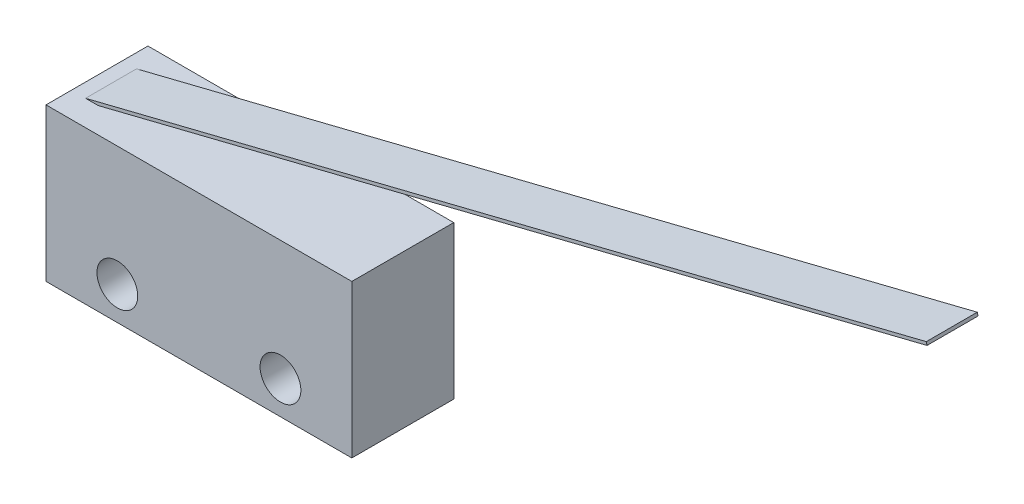
ISO-10303-21;
HEADER;
FILE_DESCRIPTION(('STEP AP214'),'2;1');
FILE_NAME('part.step','',(''),(''),'','','');
FILE_SCHEMA(('AUTOMOTIVE_DESIGN { 1 0 10303 214 1 1 1 1 }'));
ENDSEC;
DATA;
#1=APPLICATION_CONTEXT('core data for automotive mechanical design processes');
#2=APPLICATION_PROTOCOL_DEFINITION('international standard','automotive_design',2000,#1);
#3=PRODUCT_CONTEXT('',#1,'mechanical');
#4=PRODUCT('Part','Part','',(#3));
#5=PRODUCT_RELATED_PRODUCT_CATEGORY('part','',(#4));
#6=PRODUCT_DEFINITION_FORMATION('','',#4);
#7=PRODUCT_DEFINITION_CONTEXT('part definition',#1,'design');
#8=PRODUCT_DEFINITION('design','',#6,#7);
#9=PRODUCT_DEFINITION_SHAPE('','',#8);
#10=(LENGTH_UNIT() NAMED_UNIT(*) SI_UNIT(.MILLI.,.METRE.));
#11=(NAMED_UNIT(*) PLANE_ANGLE_UNIT() SI_UNIT($,.RADIAN.));
#12=(NAMED_UNIT(*) SI_UNIT($,.STERADIAN.) SOLID_ANGLE_UNIT());
#13=UNCERTAINTY_MEASURE_WITH_UNIT(LENGTH_MEASURE(1.E-05),#10,'distance_accuracy_value','');
#14=(GEOMETRIC_REPRESENTATION_CONTEXT(3) GLOBAL_UNCERTAINTY_ASSIGNED_CONTEXT((#13)) GLOBAL_UNIT_ASSIGNED_CONTEXT((#10,
#11,#12)) REPRESENTATION_CONTEXT('',''));
#15=CARTESIAN_POINT('',(0.,0.,0.));
#16=DIRECTION('',(0.,0.,1.));
#17=DIRECTION('',(1.,0.,0.));
#18=AXIS2_PLACEMENT_3D('',#15,#16,#17);
#19=CARTESIAN_POINT('',(0.,0.,6.35));
#20=DIRECTION('',(0.,0.,-1.));
#21=DIRECTION('',(-1.,0.,0.));
#22=AXIS2_PLACEMENT_3D('',#19,#20,#21);
#23=PLANE('',#22);
#24=CARTESIAN_POINT('',(4.445,2.06375,6.35));
#25=DIRECTION('',(0.,0.,1.));
#26=DIRECTION('',(1.,0.,0.));
#27=AXIS2_PLACEMENT_3D('',#24,#25,#26);
#28=CIRCLE('',#27,1.27);
#29=CARTESIAN_POINT('',(5.715,2.06375,6.35));
#30=VERTEX_POINT('',#29);
#31=EDGE_CURVE('E239',#30,#30,#28,.T.);
#32=ORIENTED_EDGE('',*,*,#31,.F.);
#33=EDGE_LOOP('',(#32));
#34=FACE_BOUND('',#33,.T.);
#35=DIRECTION('',(0.,-1.,0.));
#36=VECTOR('',#35,1.);
#37=CARTESIAN_POINT('',(0.,0.,6.35));
#38=LINE('',#37,#36);
#39=CARTESIAN_POINT('',(0.,9.525,6.35));
#40=VERTEX_POINT('',#39);
#41=CARTESIAN_POINT('',(0.,0.,6.35));
#42=VERTEX_POINT('',#41);
#43=EDGE_CURVE('E153',#40,#42,#38,.T.);
#44=ORIENTED_EDGE('',*,*,#43,.T.);
#45=DIRECTION('',(1.,0.,0.));
#46=VECTOR('',#45,1.);
#47=CARTESIAN_POINT('',(0.,0.,6.35));
#48=LINE('',#47,#46);
#49=CARTESIAN_POINT('',(19.05,0.,6.35));
#50=VERTEX_POINT('',#49);
#51=EDGE_CURVE('E96',#42,#50,#48,.T.);
#52=ORIENTED_EDGE('',*,*,#51,.T.);
#53=DIRECTION('',(0.,1.,0.));
#54=VECTOR('',#53,1.);
#55=CARTESIAN_POINT('',(19.05,0.,6.35));
#56=LINE('',#55,#54);
#57=CARTESIAN_POINT('',(19.05,9.525,6.35));
#58=VERTEX_POINT('',#57);
#59=EDGE_CURVE('E158',#50,#58,#56,.T.);
#60=ORIENTED_EDGE('',*,*,#59,.T.);
#61=DIRECTION('',(-1.,0.,0.));
#62=VECTOR('',#61,1.);
#63=CARTESIAN_POINT('',(0.,9.525,6.35));
#64=LINE('',#63,#62);
#65=EDGE_CURVE('E68',#58,#40,#64,.T.);
#66=ORIENTED_EDGE('',*,*,#65,.T.);
#67=EDGE_LOOP('',(#44,#52,#60,#66));
#68=FACE_BOUND('',#67,.T.);
#69=CARTESIAN_POINT('',(14.605,2.06375,6.35));
#70=DIRECTION('',(0.,0.,-1.));
#71=DIRECTION('',(-1.,0.,0.));
#72=AXIS2_PLACEMENT_3D('',#69,#70,#71);
#73=CIRCLE('',#72,1.27);
#74=CARTESIAN_POINT('',(13.335,2.06375,6.35));
#75=VERTEX_POINT('',#74);
#76=EDGE_CURVE('E236',#75,#75,#73,.T.);
#77=ORIENTED_EDGE('',*,*,#76,.T.);
#78=EDGE_LOOP('',(#77));
#79=FACE_BOUND('',#78,.T.);
#80=ADVANCED_FACE('F43',(#34,#68,#79),#23,.F.);
#81=CARTESIAN_POINT('',(0.,0.,0.));
#82=DIRECTION('',(0.,0.,-1.));
#83=DIRECTION('',(-1.,0.,0.));
#84=AXIS2_PLACEMENT_3D('',#81,#82,#83);
#85=PLANE('',#84);
#86=DIRECTION('',(0.,-1.,0.));
#87=VECTOR('',#86,1.);
#88=CARTESIAN_POINT('',(0.,0.,0.));
#89=LINE('',#88,#87);
#90=CARTESIAN_POINT('',(0.,9.525,0.));
#91=VERTEX_POINT('',#90);
#92=CARTESIAN_POINT('',(0.,0.,0.));
#93=VERTEX_POINT('',#92);
#94=EDGE_CURVE('E142',#91,#93,#89,.T.);
#95=ORIENTED_EDGE('',*,*,#94,.F.);
#96=DIRECTION('',(-1.,0.,0.));
#97=VECTOR('',#96,1.);
#98=CARTESIAN_POINT('',(0.,9.525,0.));
#99=LINE('',#98,#97);
#100=CARTESIAN_POINT('',(19.05,9.525,0.));
#101=VERTEX_POINT('',#100);
#102=EDGE_CURVE('E89',#101,#91,#99,.T.);
#103=ORIENTED_EDGE('',*,*,#102,.F.);
#104=DIRECTION('',(0.,1.,0.));
#105=VECTOR('',#104,1.);
#106=CARTESIAN_POINT('',(19.05,0.,0.));
#107=LINE('',#106,#105);
#108=CARTESIAN_POINT('',(19.05,0.,0.));
#109=VERTEX_POINT('',#108);
#110=EDGE_CURVE('E166',#109,#101,#107,.T.);
#111=ORIENTED_EDGE('',*,*,#110,.F.);
#112=DIRECTION('',(1.,0.,0.));
#113=VECTOR('',#112,1.);
#114=CARTESIAN_POINT('',(0.,0.,0.));
#115=LINE('',#114,#113);
#116=EDGE_CURVE('E147',#93,#109,#115,.T.);
#117=ORIENTED_EDGE('',*,*,#116,.F.);
#118=EDGE_LOOP('',(#95,#103,#111,#117));
#119=FACE_BOUND('',#118,.T.);
#120=CARTESIAN_POINT('',(4.445,2.06375,0.));
#121=DIRECTION('',(0.,0.,1.));
#122=DIRECTION('',(1.,0.,0.));
#123=AXIS2_PLACEMENT_3D('',#120,#121,#122);
#124=CIRCLE('',#123,1.27);
#125=CARTESIAN_POINT('',(5.715,2.06375,0.));
#126=VERTEX_POINT('',#125);
#127=EDGE_CURVE('E245',#126,#126,#124,.T.);
#128=ORIENTED_EDGE('',*,*,#127,.T.);
#129=EDGE_LOOP('',(#128));
#130=FACE_BOUND('',#129,.T.);
#131=CARTESIAN_POINT('',(14.605,2.06375,0.));
#132=DIRECTION('',(0.,0.,-1.));
#133=DIRECTION('',(-1.,0.,0.));
#134=AXIS2_PLACEMENT_3D('',#131,#132,#133);
#135=CIRCLE('',#134,1.27);
#136=CARTESIAN_POINT('',(13.335,2.06375,0.));
#137=VERTEX_POINT('',#136);
#138=EDGE_CURVE('E233',#137,#137,#135,.T.);
#139=ORIENTED_EDGE('',*,*,#138,.F.);
#140=EDGE_LOOP('',(#139));
#141=FACE_BOUND('',#140,.T.);
#142=ADVANCED_FACE('F184',(#119,#130,#141),#85,.T.);
#143=CARTESIAN_POINT('',(0.,9.525,6.35));
#144=DIRECTION('',(0.,-1.,0.));
#145=DIRECTION('',(0.,0.,-1.));
#146=AXIS2_PLACEMENT_3D('',#143,#144,#145);
#147=PLANE('',#146);
#148=ORIENTED_EDGE('',*,*,#102,.T.);
#149=DIRECTION('',(0.,0.,-1.));
#150=VECTOR('',#149,1.);
#151=CARTESIAN_POINT('',(0.,9.525,6.35));
#152=LINE('',#151,#150);
#153=EDGE_CURVE('E162',#40,#91,#152,.T.);
#154=ORIENTED_EDGE('',*,*,#153,.F.);
#155=ORIENTED_EDGE('',*,*,#65,.F.);
#156=DIRECTION('',(0.,0.,-1.));
#157=VECTOR('',#156,1.);
#158=CARTESIAN_POINT('',(19.05,9.525,6.35));
#159=LINE('',#158,#157);
#160=EDGE_CURVE('E173',#58,#101,#159,.T.);
#161=ORIENTED_EDGE('',*,*,#160,.T.);
#162=EDGE_LOOP('',(#148,#154,#155,#161));
#163=FACE_BOUND('',#162,.T.);
#164=DIRECTION('',(1.,0.,0.));
#165=VECTOR('',#164,1.);
#166=CARTESIAN_POINT('',(0.875640633247153,9.525,4.7625));
#167=LINE('',#166,#165);
#168=CARTESIAN_POINT('',(0.875640633247153,9.525,4.7625));
#169=VERTEX_POINT('',#168);
#170=CARTESIAN_POINT('',(1.6630848599377,9.525,4.7625));
#171=VERTEX_POINT('',#170);
#172=EDGE_CURVE('E125',#169,#171,#167,.T.);
#173=ORIENTED_EDGE('',*,*,#172,.F.);
#174=DIRECTION('',(0.,0.,-1.));
#175=VECTOR('',#174,1.);
#176=CARTESIAN_POINT('',(0.875640633247153,9.525,4.7625));
#177=LINE('',#176,#175);
#178=CARTESIAN_POINT('',(0.875640633247153,9.525,1.5875));
#179=VERTEX_POINT('',#178);
#180=EDGE_CURVE('E255',#169,#179,#177,.T.);
#181=ORIENTED_EDGE('',*,*,#180,.T.);
#182=DIRECTION('',(1.,0.,0.));
#183=VECTOR('',#182,1.);
#184=CARTESIAN_POINT('',(0.875640633247153,9.525,1.5875));
#185=LINE('',#184,#183);
#186=CARTESIAN_POINT('',(1.6630848599377,9.525,1.5875));
#187=VERTEX_POINT('',#186);
#188=EDGE_CURVE('E140',#179,#187,#185,.T.);
#189=ORIENTED_EDGE('',*,*,#188,.T.);
#190=DIRECTION('',(0.,0.,-1.));
#191=VECTOR('',#190,1.);
#192=CARTESIAN_POINT('',(1.6630848599377,9.525,4.7625));
#193=LINE('',#192,#191);
#194=EDGE_CURVE('E59',#171,#187,#193,.T.);
#195=ORIENTED_EDGE('',*,*,#194,.F.);
#196=EDGE_LOOP('',(#173,#181,#189,#195));
#197=FACE_BOUND('',#196,.T.);
#198=ADVANCED_FACE('F138',(#163,#197),#147,.F.);
#199=CARTESIAN_POINT('',(0.,0.,6.35));
#200=DIRECTION('',(1.,0.,0.));
#201=DIRECTION('',(0.,0.,-1.));
#202=AXIS2_PLACEMENT_3D('',#199,#200,#201);
#203=PLANE('',#202);
#204=ORIENTED_EDGE('',*,*,#94,.T.);
#205=DIRECTION('',(0.,0.,-1.));
#206=VECTOR('',#205,1.);
#207=CARTESIAN_POINT('',(0.,0.,6.35));
#208=LINE('',#207,#206);
#209=EDGE_CURVE('E11',#42,#93,#208,.T.);
#210=ORIENTED_EDGE('',*,*,#209,.F.);
#211=ORIENTED_EDGE('',*,*,#43,.F.);
#212=ORIENTED_EDGE('',*,*,#153,.T.);
#213=EDGE_LOOP('',(#204,#210,#211,#212));
#214=FACE_BOUND('',#213,.T.);
#215=ADVANCED_FACE('F45',(#214),#203,.F.);
#216=CARTESIAN_POINT('',(0.,0.,6.35));
#217=DIRECTION('',(0.,1.,0.));
#218=DIRECTION('',(0.,0.,1.));
#219=AXIS2_PLACEMENT_3D('',#216,#217,#218);
#220=PLANE('',#219);
#221=ORIENTED_EDGE('',*,*,#116,.T.);
#222=DIRECTION('',(0.,0.,-1.));
#223=VECTOR('',#222,1.);
#224=CARTESIAN_POINT('',(19.05,0.,6.35));
#225=LINE('',#224,#223);
#226=EDGE_CURVE('E52',#50,#109,#225,.T.);
#227=ORIENTED_EDGE('',*,*,#226,.F.);
#228=ORIENTED_EDGE('',*,*,#51,.F.);
#229=ORIENTED_EDGE('',*,*,#209,.T.);
#230=EDGE_LOOP('',(#221,#227,#228,#229));
#231=FACE_BOUND('',#230,.T.);
#232=ADVANCED_FACE('F195',(#231),#220,.F.);
#233=CARTESIAN_POINT('',(19.05,0.,6.35));
#234=DIRECTION('',(-1.,0.,0.));
#235=DIRECTION('',(0.,0.,1.));
#236=AXIS2_PLACEMENT_3D('',#233,#234,#235);
#237=PLANE('',#236);
#238=ORIENTED_EDGE('',*,*,#110,.T.);
#239=ORIENTED_EDGE('',*,*,#160,.F.);
#240=ORIENTED_EDGE('',*,*,#59,.F.);
#241=ORIENTED_EDGE('',*,*,#226,.T.);
#242=EDGE_LOOP('',(#238,#239,#240,#241));
#243=FACE_BOUND('',#242,.T.);
#244=ADVANCED_FACE('F180',(#243),#237,.F.);
#245=CARTESIAN_POINT('',(53.2934385801058,22.3978929791365,4.7625));
#246=DIRECTION('',(-0.241921895599669,0.970295726275996,0.));
#247=DIRECTION('',(-0.970295726275996,-0.241921895599669,0.));
#248=AXIS2_PLACEMENT_3D('',#245,#246,#247);
#249=PLANE('',#248);
#250=DIRECTION('',(0.970295726275996,0.241921895599669,0.));
#251=VECTOR('',#250,1.);
#252=CARTESIAN_POINT('',(53.2934385801058,22.3978929791365,1.5875));
#253=LINE('',#252,#251);
#254=CARTESIAN_POINT('',(53.2934385801058,22.3978929791365,1.5875));
#255=VERTEX_POINT('',#254);
#256=EDGE_CURVE('E258',#187,#255,#253,.T.);
#257=ORIENTED_EDGE('',*,*,#256,.T.);
#258=DIRECTION('',(0.,0.,-1.));
#259=VECTOR('',#258,1.);
#260=CARTESIAN_POINT('',(53.2934385801058,22.3978929791365,4.7625));
#261=LINE('',#260,#259);
#262=CARTESIAN_POINT('',(53.2934385801058,22.3978929791365,4.7625));
#263=VERTEX_POINT('',#262);
#264=EDGE_CURVE('E120',#263,#255,#261,.T.);
#265=ORIENTED_EDGE('',*,*,#264,.F.);
#266=DIRECTION('',(0.970295726275996,0.241921895599669,0.));
#267=VECTOR('',#266,1.);
#268=CARTESIAN_POINT('',(53.2934385801058,22.3978929791365,4.7625));
#269=LINE('',#268,#267);
#270=EDGE_CURVE('E116',#171,#263,#269,.T.);
#271=ORIENTED_EDGE('',*,*,#270,.F.);
#272=ORIENTED_EDGE('',*,*,#194,.T.);
#273=EDGE_LOOP('',(#257,#265,#271,#272));
#274=FACE_BOUND('',#273,.T.);
#275=ADVANCED_FACE('F118',(#274),#249,.F.);
#276=CARTESIAN_POINT('',(53.2473524589941,22.5827343149921,4.7625));
#277=DIRECTION('',(-0.970295726276002,-0.241921895599647,0.));
#278=DIRECTION('',(0.241921895599647,-0.970295726276002,0.));
#279=AXIS2_PLACEMENT_3D('',#276,#277,#278);
#280=PLANE('',#279);
#281=DIRECTION('',(-0.241921895599647,0.970295726276002,0.));
#282=VECTOR('',#281,1.);
#283=CARTESIAN_POINT('',(53.2473524589941,22.5827343149921,1.5875));
#284=LINE('',#283,#282);
#285=CARTESIAN_POINT('',(53.2473524589941,22.5827343149921,1.5875));
#286=VERTEX_POINT('',#285);
#287=EDGE_CURVE('E261',#255,#286,#284,.T.);
#288=ORIENTED_EDGE('',*,*,#287,.T.);
#289=DIRECTION('',(0.,0.,-1.));
#290=VECTOR('',#289,1.);
#291=CARTESIAN_POINT('',(53.2473524589941,22.5827343149921,4.7625));
#292=LINE('',#291,#290);
#293=CARTESIAN_POINT('',(53.2473524589941,22.5827343149921,4.7625));
#294=VERTEX_POINT('',#293);
#295=EDGE_CURVE('E149',#294,#286,#292,.T.);
#296=ORIENTED_EDGE('',*,*,#295,.F.);
#297=DIRECTION('',(-0.241921895599647,0.970295726276002,0.));
#298=VECTOR('',#297,1.);
#299=CARTESIAN_POINT('',(53.2473524589941,22.5827343149921,4.7625));
#300=LINE('',#299,#298);
#301=EDGE_CURVE('E124',#263,#294,#300,.T.);
#302=ORIENTED_EDGE('',*,*,#301,.F.);
#303=ORIENTED_EDGE('',*,*,#264,.T.);
#304=EDGE_LOOP('',(#288,#296,#302,#303));
#305=FACE_BOUND('',#304,.T.);
#306=ADVANCED_FACE('F207',(#305),#280,.F.);
#307=CARTESIAN_POINT('',(0.875640633247153,9.525,4.7625));
#308=DIRECTION('',(0.241921895599669,-0.970295726275996,0.));
#309=DIRECTION('',(0.970295726275996,0.241921895599669,0.));
#310=AXIS2_PLACEMENT_3D('',#307,#308,#309);
#311=PLANE('',#310);
#312=DIRECTION('',(-0.970295726275996,-0.241921895599669,0.));
#313=VECTOR('',#312,1.);
#314=CARTESIAN_POINT('',(0.875640633247153,9.525,1.5875));
#315=LINE('',#314,#313);
#316=EDGE_CURVE('E135',#286,#179,#315,.T.);
#317=ORIENTED_EDGE('',*,*,#316,.T.);
#318=ORIENTED_EDGE('',*,*,#180,.F.);
#319=DIRECTION('',(-0.970295726275996,-0.241921895599669,0.));
#320=VECTOR('',#319,1.);
#321=CARTESIAN_POINT('',(0.875640633247153,9.525,4.7625));
#322=LINE('',#321,#320);
#323=EDGE_CURVE('E130',#294,#169,#322,.T.);
#324=ORIENTED_EDGE('',*,*,#323,.F.);
#325=ORIENTED_EDGE('',*,*,#295,.T.);
#326=EDGE_LOOP('',(#317,#318,#324,#325));
#327=FACE_BOUND('',#326,.T.);
#328=ADVANCED_FACE('F210',(#327),#311,.F.);
#329=CARTESIAN_POINT('',(0.,0.,4.7625));
#330=DIRECTION('',(0.,0.,-1.));
#331=DIRECTION('',(-1.,0.,0.));
#332=AXIS2_PLACEMENT_3D('',#329,#330,#331);
#333=PLANE('',#332);
#334=ORIENTED_EDGE('',*,*,#172,.T.);
#335=ORIENTED_EDGE('',*,*,#270,.T.);
#336=ORIENTED_EDGE('',*,*,#301,.T.);
#337=ORIENTED_EDGE('',*,*,#323,.T.);
#338=EDGE_LOOP('',(#334,#335,#336,#337));
#339=FACE_BOUND('',#338,.T.);
#340=ADVANCED_FACE('F128',(#339),#333,.F.);
#341=CARTESIAN_POINT('',(0.,0.,1.5875));
#342=DIRECTION('',(0.,0.,-1.));
#343=DIRECTION('',(-1.,0.,0.));
#344=AXIS2_PLACEMENT_3D('',#341,#342,#343);
#345=PLANE('',#344);
#346=ORIENTED_EDGE('',*,*,#188,.F.);
#347=ORIENTED_EDGE('',*,*,#316,.F.);
#348=ORIENTED_EDGE('',*,*,#287,.F.);
#349=ORIENTED_EDGE('',*,*,#256,.F.);
#350=EDGE_LOOP('',(#346,#347,#348,#349));
#351=FACE_BOUND('',#350,.T.);
#352=ADVANCED_FACE('F215',(#351),#345,.T.);
#353=CARTESIAN_POINT('',(4.445,2.06375,0.));
#354=DIRECTION('',(0.,0.,1.));
#355=DIRECTION('',(1.,0.,0.));
#356=AXIS2_PLACEMENT_3D('',#353,#354,#355);
#357=CYLINDRICAL_SURFACE('',#356,1.27);
#358=ORIENTED_EDGE('',*,*,#127,.F.);
#359=EDGE_LOOP('',(#358));
#360=FACE_BOUND('',#359,.T.);
#361=ORIENTED_EDGE('',*,*,#31,.T.);
#362=EDGE_LOOP('',(#361));
#363=FACE_BOUND('',#362,.T.);
#364=ADVANCED_FACE('F218',(#360,#363),#357,.F.);
#365=CARTESIAN_POINT('',(14.605,2.06375,0.));
#366=DIRECTION('',(0.,0.,1.));
#367=DIRECTION('',(1.,0.,0.));
#368=AXIS2_PLACEMENT_3D('',#365,#366,#367);
#369=CYLINDRICAL_SURFACE('',#368,1.27);
#370=ORIENTED_EDGE('',*,*,#138,.T.);
#371=EDGE_LOOP('',(#370));
#372=FACE_BOUND('',#371,.T.);
#373=ORIENTED_EDGE('',*,*,#76,.F.);
#374=EDGE_LOOP('',(#373));
#375=FACE_BOUND('',#374,.T.);
#376=ADVANCED_FACE('F224',(#372,#375),#369,.F.);
#377=CLOSED_SHELL('',(#80,#142,#198,#215,#232,#244,#275,#306,#328,#340,#352,#364,#376));
#378=MANIFOLD_SOLID_BREP('B2',#377);
#379=ADVANCED_BREP_SHAPE_REPRESENTATION('',(#18,#378),#14);
#380=SHAPE_DEFINITION_REPRESENTATION(#9,#379);
ENDSEC;
END-ISO-10303-21;
